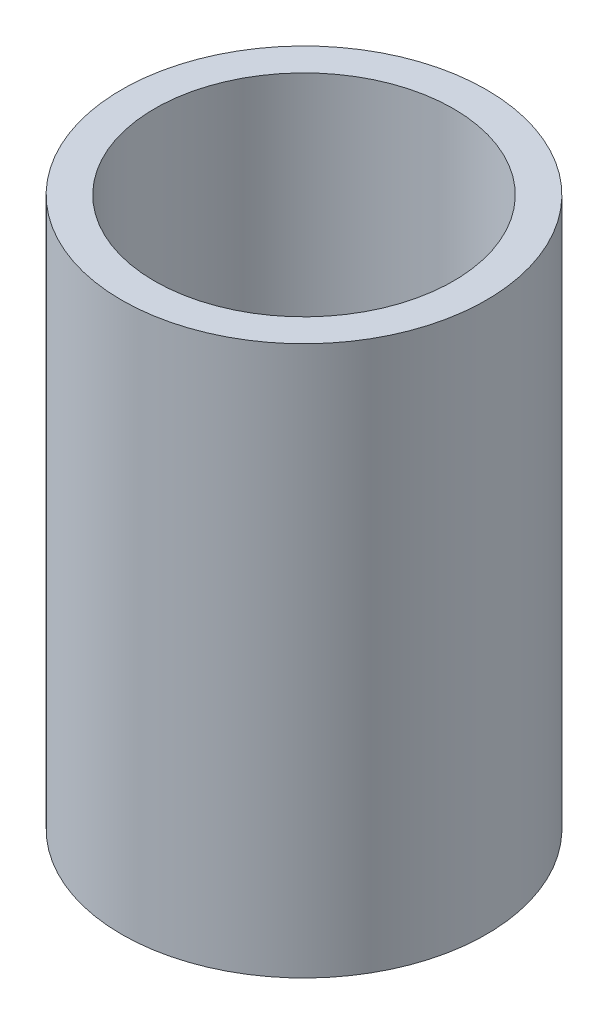
ISO-10303-21;
HEADER;
FILE_DESCRIPTION(('STEP AP214'),'2;1');
FILE_NAME('part.step','',(''),(''),'','','');
FILE_SCHEMA(('AUTOMOTIVE_DESIGN { 1 0 10303 214 1 1 1 1 }'));
ENDSEC;
DATA;
#1=APPLICATION_CONTEXT('core data for automotive mechanical design processes');
#2=APPLICATION_PROTOCOL_DEFINITION('international standard','automotive_design',2000,#1);
#3=PRODUCT_CONTEXT('',#1,'mechanical');
#4=PRODUCT('Part','Part','',(#3));
#5=PRODUCT_RELATED_PRODUCT_CATEGORY('part','',(#4));
#6=PRODUCT_DEFINITION_FORMATION('','',#4);
#7=PRODUCT_DEFINITION_CONTEXT('part definition',#1,'design');
#8=PRODUCT_DEFINITION('design','',#6,#7);
#9=PRODUCT_DEFINITION_SHAPE('','',#8);
#10=(LENGTH_UNIT() NAMED_UNIT(*) SI_UNIT(.MILLI.,.METRE.));
#11=(NAMED_UNIT(*) PLANE_ANGLE_UNIT() SI_UNIT($,.RADIAN.));
#12=(NAMED_UNIT(*) SI_UNIT($,.STERADIAN.) SOLID_ANGLE_UNIT());
#13=UNCERTAINTY_MEASURE_WITH_UNIT(LENGTH_MEASURE(1.E-05),#10,'distance_accuracy_value','');
#14=(GEOMETRIC_REPRESENTATION_CONTEXT(3) GLOBAL_UNCERTAINTY_ASSIGNED_CONTEXT((#13)) GLOBAL_UNIT_ASSIGNED_CONTEXT((#10,
#11,#12)) REPRESENTATION_CONTEXT('',''));
#15=CARTESIAN_POINT('',(0.,0.,0.));
#16=DIRECTION('',(0.,0.,1.));
#17=DIRECTION('',(1.,0.,0.));
#18=AXIS2_PLACEMENT_3D('',#15,#16,#17);
#19=CARTESIAN_POINT('',(0.,0.,0.));
#20=DIRECTION('',(0.,1.,0.));
#21=DIRECTION('',(0.,0.,1.));
#22=AXIS2_PLACEMENT_3D('',#19,#20,#21);
#23=CYLINDRICAL_SURFACE('',#22,17.272);
#24=CARTESIAN_POINT('',(0.,63.5,0.));
#25=DIRECTION('',(0.,1.,0.));
#26=DIRECTION('',(0.,0.,1.));
#27=AXIS2_PLACEMENT_3D('',#24,#25,#26);
#28=CIRCLE('',#27,17.272);
#29=CARTESIAN_POINT('',(0.,63.5,17.272));
#30=VERTEX_POINT('',#29);
#31=EDGE_CURVE('E17',#30,#30,#28,.F.);
#32=ORIENTED_EDGE('',*,*,#31,.F.);
#33=EDGE_LOOP('',(#32));
#34=FACE_BOUND('',#33,.T.);
#35=CARTESIAN_POINT('',(0.,0.,0.));
#36=DIRECTION('',(0.,1.,0.));
#37=DIRECTION('',(0.,0.,1.));
#38=AXIS2_PLACEMENT_3D('',#35,#36,#37);
#39=CIRCLE('',#38,17.272);
#40=CARTESIAN_POINT('',(0.,0.,17.272));
#41=VERTEX_POINT('',#40);
#42=EDGE_CURVE('E26',#41,#41,#39,.F.);
#43=ORIENTED_EDGE('',*,*,#42,.T.);
#44=EDGE_LOOP('',(#43));
#45=FACE_BOUND('',#44,.T.);
#46=ADVANCED_FACE('F14',(#34,#45),#23,.F.);
#47=CARTESIAN_POINT('',(0.,63.5,0.));
#48=DIRECTION('',(0.,1.,0.));
#49=DIRECTION('',(0.,0.,1.));
#50=AXIS2_PLACEMENT_3D('',#47,#48,#49);
#51=PLANE('',#50);
#52=ORIENTED_EDGE('',*,*,#31,.T.);
#53=EDGE_LOOP('',(#52));
#54=FACE_BOUND('',#53,.T.);
#55=CARTESIAN_POINT('',(0.,63.5,0.));
#56=DIRECTION('',(0.,1.,0.));
#57=DIRECTION('',(0.,0.,1.));
#58=AXIS2_PLACEMENT_3D('',#55,#56,#57);
#59=CIRCLE('',#58,21.082);
#60=CARTESIAN_POINT('',(0.,63.5,21.082));
#61=VERTEX_POINT('',#60);
#62=EDGE_CURVE('E21',#61,#61,#59,.F.);
#63=ORIENTED_EDGE('',*,*,#62,.F.);
#64=EDGE_LOOP('',(#63));
#65=FACE_BOUND('',#64,.T.);
#66=ADVANCED_FACE('F34',(#54,#65),#51,.T.);
#67=CARTESIAN_POINT('',(0.,0.,0.));
#68=DIRECTION('',(0.,1.,0.));
#69=DIRECTION('',(0.,0.,1.));
#70=AXIS2_PLACEMENT_3D('',#67,#68,#69);
#71=PLANE('',#70);
#72=ORIENTED_EDGE('',*,*,#42,.F.);
#73=EDGE_LOOP('',(#72));
#74=FACE_BOUND('',#73,.T.);
#75=CARTESIAN_POINT('',(0.,0.,0.));
#76=DIRECTION('',(0.,1.,0.));
#77=DIRECTION('',(0.,0.,1.));
#78=AXIS2_PLACEMENT_3D('',#75,#76,#77);
#79=CIRCLE('',#78,21.082);
#80=CARTESIAN_POINT('',(0.,0.,21.082));
#81=VERTEX_POINT('',#80);
#82=EDGE_CURVE('E10',#81,#81,#79,.T.);
#83=ORIENTED_EDGE('',*,*,#82,.F.);
#84=EDGE_LOOP('',(#83));
#85=FACE_BOUND('',#84,.T.);
#86=ADVANCED_FACE('F42',(#74,#85),#71,.F.);
#87=CARTESIAN_POINT('',(0.,0.,0.));
#88=DIRECTION('',(0.,1.,0.));
#89=DIRECTION('',(0.,0.,1.));
#90=AXIS2_PLACEMENT_3D('',#87,#88,#89);
#91=CYLINDRICAL_SURFACE('',#90,21.082);
#92=ORIENTED_EDGE('',*,*,#62,.T.);
#93=EDGE_LOOP('',(#92));
#94=FACE_BOUND('',#93,.T.);
#95=ORIENTED_EDGE('',*,*,#82,.T.);
#96=EDGE_LOOP('',(#95));
#97=FACE_BOUND('',#96,.T.);
#98=ADVANCED_FACE('F43',(#94,#97),#91,.T.);
#99=CLOSED_SHELL('',(#46,#66,#86,#98));
#100=MANIFOLD_SOLID_BREP('B1',#99);
#101=ADVANCED_BREP_SHAPE_REPRESENTATION('',(#18,#100),#14);
#102=SHAPE_DEFINITION_REPRESENTATION(#9,#101);
ENDSEC;
END-ISO-10303-21;
